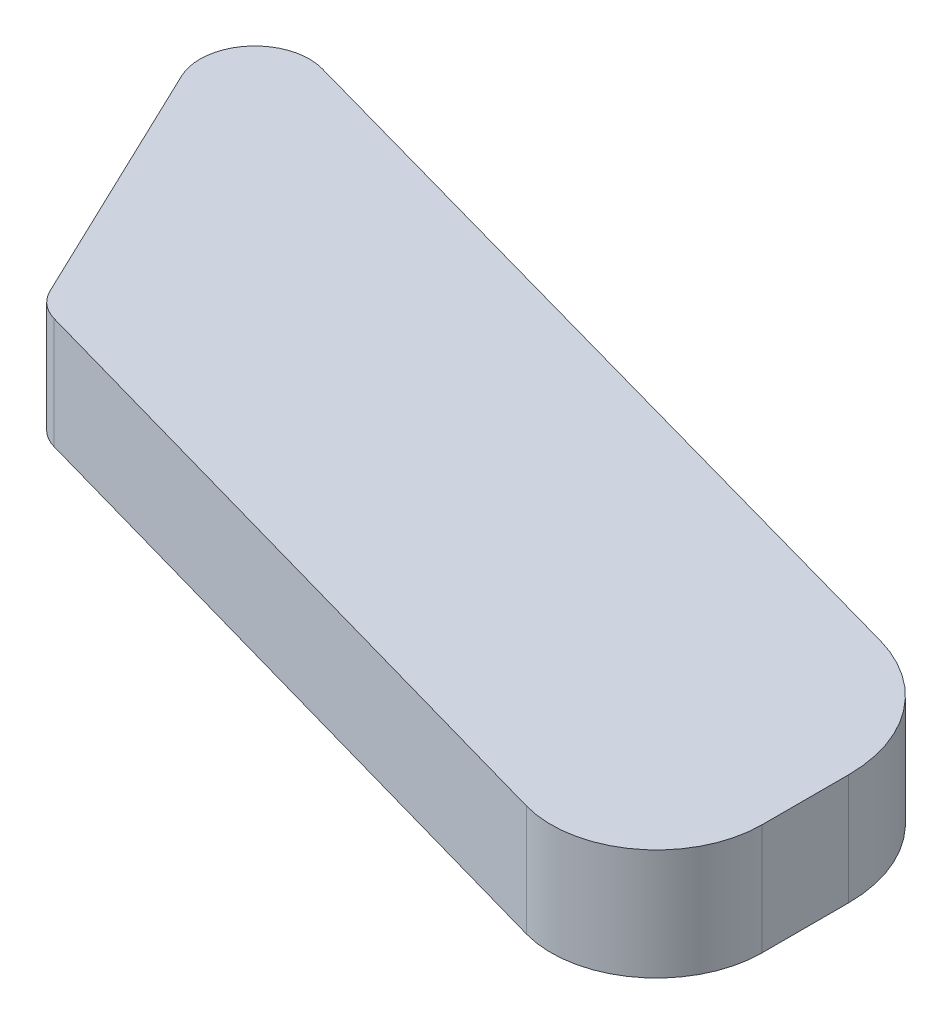
ISO-10303-21;
HEADER;
FILE_DESCRIPTION(('STEP AP214'),'2;1');
FILE_NAME('part.step','',(''),(''),'','','');
FILE_SCHEMA(('AUTOMOTIVE_DESIGN { 1 0 10303 214 1 1 1 1 }'));
ENDSEC;
DATA;
#1=APPLICATION_CONTEXT('core data for automotive mechanical design processes');
#2=APPLICATION_PROTOCOL_DEFINITION('international standard','automotive_design',2000,#1);
#3=PRODUCT_CONTEXT('',#1,'mechanical');
#4=PRODUCT('Part','Part','',(#3));
#5=PRODUCT_RELATED_PRODUCT_CATEGORY('part','',(#4));
#6=PRODUCT_DEFINITION_FORMATION('','',#4);
#7=PRODUCT_DEFINITION_CONTEXT('part definition',#1,'design');
#8=PRODUCT_DEFINITION('design','',#6,#7);
#9=PRODUCT_DEFINITION_SHAPE('','',#8);
#10=(LENGTH_UNIT() NAMED_UNIT(*) SI_UNIT(.MILLI.,.METRE.));
#11=(NAMED_UNIT(*) PLANE_ANGLE_UNIT() SI_UNIT($,.RADIAN.));
#12=(NAMED_UNIT(*) SI_UNIT($,.STERADIAN.) SOLID_ANGLE_UNIT());
#13=UNCERTAINTY_MEASURE_WITH_UNIT(LENGTH_MEASURE(1.E-05),#10,'distance_accuracy_value','');
#14=(GEOMETRIC_REPRESENTATION_CONTEXT(3) GLOBAL_UNCERTAINTY_ASSIGNED_CONTEXT((#13)) GLOBAL_UNIT_ASSIGNED_CONTEXT((#10,
#11,#12)) REPRESENTATION_CONTEXT('',''));
#15=CARTESIAN_POINT('',(0.,0.,0.));
#16=DIRECTION('',(0.,0.,1.));
#17=DIRECTION('',(1.,0.,0.));
#18=AXIS2_PLACEMENT_3D('',#15,#16,#17);
#19=CARTESIAN_POINT('',(-0.698314927087195,2.9906,4.1168302330735));
#20=DIRECTION('',(0.,-1.,0.));
#21=DIRECTION('',(-1.,0.,0.));
#22=AXIS2_PLACEMENT_3D('',#19,#20,#21);
#23=CYLINDRICAL_SURFACE('',#22,0.0296244305342817);
#24=CARTESIAN_POINT('',(-0.698314927087195,2.9906,4.1168302330735));
#25=DIRECTION('',(0.,1.,0.));
#26=DIRECTION('',(1.,0.,0.));
#27=AXIS2_PLACEMENT_3D('',#24,#25,#26);
#28=CIRCLE('',#27,0.0296244305342817);
#29=CARTESIAN_POINT('',(-0.727939357621477,2.9906,4.1168302330735));
#30=VERTEX_POINT('',#29);
#31=CARTESIAN_POINT('',(-0.725045279626244,2.9906,4.1296011037415));
#32=VERTEX_POINT('',#31);
#33=EDGE_CURVE('E11',#30,#32,#28,.T.);
#34=ORIENTED_EDGE('',*,*,#33,.F.);
#35=DIRECTION('',(0.,-1.,0.));
#36=VECTOR('',#35,1.);
#37=CARTESIAN_POINT('',(-0.727939357621477,2.9906,4.1168302330735));
#38=LINE('',#37,#36);
#39=CARTESIAN_POINT('',(-0.727939357621477,2.9306,4.1168302330735));
#40=VERTEX_POINT('',#39);
#41=EDGE_CURVE('E24',#30,#40,#38,.T.);
#42=ORIENTED_EDGE('',*,*,#41,.T.);
#43=CARTESIAN_POINT('',(-0.698314927087195,2.9306,4.1168302330735));
#44=DIRECTION('',(0.,1.,0.));
#45=DIRECTION('',(1.,0.,0.));
#46=AXIS2_PLACEMENT_3D('',#43,#44,#45);
#47=CIRCLE('',#46,0.0296244305342817);
#48=CARTESIAN_POINT('',(-0.725045279626244,2.9306,4.1296011037415));
#49=VERTEX_POINT('',#48);
#50=EDGE_CURVE('E157',#40,#49,#47,.T.);
#51=ORIENTED_EDGE('',*,*,#50,.T.);
#52=DIRECTION('',(0.,-1.,0.));
#53=VECTOR('',#52,1.);
#54=CARTESIAN_POINT('',(-0.725045279626244,2.9906,4.1296011037415));
#55=LINE('',#54,#53);
#56=EDGE_CURVE('E154',#32,#49,#55,.T.);
#57=ORIENTED_EDGE('',*,*,#56,.F.);
#58=EDGE_LOOP('',(#34,#42,#51,#57));
#59=FACE_BOUND('',#58,.T.);
#60=ADVANCED_FACE('F17',(#59),#23,.T.);
#61=CARTESIAN_POINT('',(-0.291431756941058,2.9906,4.27661368515));
#62=DIRECTION('',(0.,-1.,0.));
#63=DIRECTION('',(-1.,0.,0.));
#64=AXIS2_PLACEMENT_3D('',#61,#62,#63);
#65=CYLINDRICAL_SURFACE('',#64,0.0740610763358077);
#66=CARTESIAN_POINT('',(-0.291431756941058,2.9306,4.27661368515));
#67=DIRECTION('',(0.,1.,0.));
#68=DIRECTION('',(1.,0.,0.));
#69=AXIS2_PLACEMENT_3D('',#66,#67,#68);
#70=CIRCLE('',#69,0.0740610763358077);
#71=CARTESIAN_POINT('',(-0.21737068072653,2.9306,4.2766094467354));
#72=VERTEX_POINT('',#71);
#73=CARTESIAN_POINT('',(-0.271508401674307,2.9306,4.205282745559));
#74=VERTEX_POINT('',#73);
#75=EDGE_CURVE('E152',#72,#74,#70,.T.);
#76=ORIENTED_EDGE('',*,*,#75,.T.);
#77=DIRECTION('',(0.,-1.,0.));
#78=VECTOR('',#77,1.);
#79=CARTESIAN_POINT('',(-0.271508401674307,2.9906,4.205282745559));
#80=LINE('',#79,#78);
#81=CARTESIAN_POINT('',(-0.271508401674307,2.9906,4.205282745559));
#82=VERTEX_POINT('',#81);
#83=EDGE_CURVE('E149',#82,#74,#80,.T.);
#84=ORIENTED_EDGE('',*,*,#83,.F.);
#85=CARTESIAN_POINT('',(-0.291431756941058,2.9906,4.27661368515));
#86=DIRECTION('',(0.,1.,0.));
#87=DIRECTION('',(1.,0.,0.));
#88=AXIS2_PLACEMENT_3D('',#85,#86,#87);
#89=CIRCLE('',#88,0.0740610763358077);
#90=CARTESIAN_POINT('',(-0.21737068072653,2.9906,4.2766094467354));
#91=VERTEX_POINT('',#90);
#92=EDGE_CURVE('E147',#91,#82,#89,.T.);
#93=ORIENTED_EDGE('',*,*,#92,.F.);
#94=DIRECTION('',(0.,-1.,0.));
#95=VECTOR('',#94,1.);
#96=CARTESIAN_POINT('',(-0.21737068072653,2.9906,4.2766094467354));
#97=LINE('',#96,#95);
#98=EDGE_CURVE('E109',#91,#72,#97,.T.);
#99=ORIENTED_EDGE('',*,*,#98,.T.);
#100=EDGE_LOOP('',(#76,#84,#93,#99));
#101=FACE_BOUND('',#100,.T.);
#102=ADVANCED_FACE('F172',(#101),#65,.T.);
#103=CARTESIAN_POINT('',(-0.271508401674307,2.9906,4.205282745559));
#104=DIRECTION('',(-0.269012499581205,0.,0.963136685558738));
#105=DIRECTION('',(0.963136685558738,0.,0.269012499581205));
#106=AXIS2_PLACEMENT_3D('',#103,#104,#105);
#107=PLANE('',#106);
#108=DIRECTION('',(-0.963136685558738,0.,-0.269012499581205));
#109=VECTOR('',#108,1.);
#110=CARTESIAN_POINT('',(-0.271508401674307,2.9306,4.205282745559));
#111=LINE('',#110,#109);
#112=CARTESIAN_POINT('',(-0.690345584980515,2.9306,4.0882978572372));
#113=VERTEX_POINT('',#112);
#114=EDGE_CURVE('E144',#74,#113,#111,.T.);
#115=ORIENTED_EDGE('',*,*,#114,.T.);
#116=DIRECTION('',(0.,-1.,0.));
#117=VECTOR('',#116,1.);
#118=CARTESIAN_POINT('',(-0.690345584980515,2.9906,4.0882978572372));
#119=LINE('',#118,#117);
#120=CARTESIAN_POINT('',(-0.690345584980515,2.9906,4.0882978572372));
#121=VERTEX_POINT('',#120);
#122=EDGE_CURVE('E141',#121,#113,#119,.T.);
#123=ORIENTED_EDGE('',*,*,#122,.F.);
#124=DIRECTION('',(-0.963136685558738,0.,-0.269012499581205));
#125=VECTOR('',#124,1.);
#126=CARTESIAN_POINT('',(-0.271508401674307,2.9906,4.205282745559));
#127=LINE('',#126,#125);
#128=EDGE_CURVE('E138',#82,#121,#127,.T.);
#129=ORIENTED_EDGE('',*,*,#128,.F.);
#130=ORIENTED_EDGE('',*,*,#83,.T.);
#131=EDGE_LOOP('',(#115,#123,#129,#130));
#132=FACE_BOUND('',#131,.T.);
#133=ADVANCED_FACE('F170',(#132),#107,.F.);
#134=CARTESIAN_POINT('',(-0.698314927087195,2.9906,4.1168302330735));
#135=DIRECTION('',(0.,-1.,0.));
#136=DIRECTION('',(-1.,0.,0.));
#137=AXIS2_PLACEMENT_3D('',#134,#135,#136);
#138=CYLINDRICAL_SURFACE('',#137,0.0296244305342817);
#139=ORIENTED_EDGE('',*,*,#41,.F.);
#140=CARTESIAN_POINT('',(-0.698314927087195,2.9906,4.1168302330735));
#141=DIRECTION('',(0.,1.,0.));
#142=DIRECTION('',(1.,0.,0.));
#143=AXIS2_PLACEMENT_3D('',#140,#141,#142);
#144=CIRCLE('',#143,0.0296244305342817);
#145=EDGE_CURVE('E136',#121,#30,#144,.T.);
#146=ORIENTED_EDGE('',*,*,#145,.F.);
#147=ORIENTED_EDGE('',*,*,#122,.T.);
#148=CARTESIAN_POINT('',(-0.698314927087195,2.9306,4.1168302330735));
#149=DIRECTION('',(0.,1.,0.));
#150=DIRECTION('',(1.,0.,0.));
#151=AXIS2_PLACEMENT_3D('',#148,#149,#150);
#152=CIRCLE('',#151,0.0296244305342817);
#153=EDGE_CURVE('E133',#113,#40,#152,.T.);
#154=ORIENTED_EDGE('',*,*,#153,.T.);
#155=EDGE_LOOP('',(#139,#146,#147,#154));
#156=FACE_BOUND('',#155,.T.);
#157=ADVANCED_FACE('F167',(#156),#138,.T.);
#158=CARTESIAN_POINT('',(-0.725045279626244,2.9906,4.1296011037415));
#159=DIRECTION('',(0.902307725649932,0.,-0.431092528620535));
#160=DIRECTION('',(-0.431092528620535,0.,-0.902307725649932));
#161=AXIS2_PLACEMENT_3D('',#158,#159,#160);
#162=PLANE('',#161);
#163=DIRECTION('',(0.431092528620535,0.,0.902307725649932));
#164=VECTOR('',#163,1.);
#165=CARTESIAN_POINT('',(-0.725045279626244,2.9306,4.1296011037415));
#166=LINE('',#165,#164);
#167=CARTESIAN_POINT('',(-0.659881299097407,2.9306,4.2659940105113));
#168=VERTEX_POINT('',#167);
#169=EDGE_CURVE('E131',#49,#168,#166,.T.);
#170=ORIENTED_EDGE('',*,*,#169,.T.);
#171=DIRECTION('',(0.,-1.,0.));
#172=VECTOR('',#171,1.);
#173=CARTESIAN_POINT('',(-0.659881299097407,2.9906,4.2659940105113));
#174=LINE('',#173,#172);
#175=CARTESIAN_POINT('',(-0.659881299097407,2.9906,4.2659940105113));
#176=VERTEX_POINT('',#175);
#177=EDGE_CURVE('E128',#176,#168,#174,.T.);
#178=ORIENTED_EDGE('',*,*,#177,.F.);
#179=DIRECTION('',(0.431092528620535,0.,0.902307725649932));
#180=VECTOR('',#179,1.);
#181=CARTESIAN_POINT('',(-0.725045279626244,2.9906,4.1296011037415));
#182=LINE('',#181,#180);
#183=EDGE_CURVE('E126',#32,#176,#182,.T.);
#184=ORIENTED_EDGE('',*,*,#183,.F.);
#185=ORIENTED_EDGE('',*,*,#56,.T.);
#186=EDGE_LOOP('',(#170,#178,#184,#185));
#187=FACE_BOUND('',#186,.T.);
#188=ADVANCED_FACE('F181',(#187),#162,.F.);
#189=CARTESIAN_POINT('',(-0.639833534693121,2.9906,4.2564158575103));
#190=DIRECTION('',(0.,-1.,0.));
#191=DIRECTION('',(-1.,0.,0.));
#192=AXIS2_PLACEMENT_3D('',#189,#190,#191);
#193=CYLINDRICAL_SURFACE('',#192,0.0222183229006932);
#194=CARTESIAN_POINT('',(-0.639833534693121,2.9306,4.2564158575103));
#195=DIRECTION('',(0.,1.,0.));
#196=DIRECTION('',(1.,0.,0.));
#197=AXIS2_PLACEMENT_3D('',#194,#195,#196);
#198=CIRCLE('',#197,0.0222183229006932);
#199=CARTESIAN_POINT('',(-0.645872484521788,2.9306,4.2777977413723));
#200=VERTEX_POINT('',#199);
#201=EDGE_CURVE('E124',#168,#200,#198,.T.);
#202=ORIENTED_EDGE('',*,*,#201,.T.);
#203=DIRECTION('',(0.,-1.,0.));
#204=VECTOR('',#203,1.);
#205=CARTESIAN_POINT('',(-0.645872484521788,2.9906,4.2777977413723));
#206=LINE('',#205,#204);
#207=CARTESIAN_POINT('',(-0.645872484521788,2.9906,4.2777977413723));
#208=VERTEX_POINT('',#207);
#209=EDGE_CURVE('E121',#208,#200,#206,.T.);
#210=ORIENTED_EDGE('',*,*,#209,.F.);
#211=CARTESIAN_POINT('',(-0.639833534693121,2.9906,4.2564158575103));
#212=DIRECTION('',(0.,1.,0.));
#213=DIRECTION('',(1.,0.,0.));
#214=AXIS2_PLACEMENT_3D('',#211,#212,#213);
#215=CIRCLE('',#214,0.0222183229006932);
#216=EDGE_CURVE('E119',#176,#208,#215,.T.);
#217=ORIENTED_EDGE('',*,*,#216,.F.);
#218=ORIENTED_EDGE('',*,*,#177,.T.);
#219=EDGE_LOOP('',(#202,#210,#217,#218));
#220=FACE_BOUND('',#219,.T.);
#221=ADVANCED_FACE('F178',(#220),#193,.T.);
#222=CARTESIAN_POINT('',(-0.645872484521788,2.9906,4.2777977413723));
#223=DIRECTION('',(0.271800434966713,0.,-0.962353637470086));
#224=DIRECTION('',(-0.962353637470086,0.,-0.271800434966713));
#225=AXIS2_PLACEMENT_3D('',#222,#223,#224);
#226=PLANE('',#225);
#227=DIRECTION('',(0.962353637470086,0.,0.271800434966713));
#228=VECTOR('',#227,1.);
#229=CARTESIAN_POINT('',(-0.645872484521788,2.9306,4.2777977413723));
#230=LINE('',#229,#228);
#231=CARTESIAN_POINT('',(-0.289894999782774,2.9306,4.3783375340464));
#232=VERTEX_POINT('',#231);
#233=EDGE_CURVE('E117',#200,#232,#230,.T.);
#234=ORIENTED_EDGE('',*,*,#233,.T.);
#235=DIRECTION('',(0.,-1.,0.));
#236=VECTOR('',#235,1.);
#237=CARTESIAN_POINT('',(-0.289894999782774,2.9906,4.3783375340464));
#238=LINE('',#237,#236);
#239=CARTESIAN_POINT('',(-0.289894999782774,2.9906,4.3783375340464));
#240=VERTEX_POINT('',#239);
#241=EDGE_CURVE('E115',#240,#232,#238,.T.);
#242=ORIENTED_EDGE('',*,*,#241,.F.);
#243=DIRECTION('',(0.962353637470086,0.,0.271800434966713));
#244=VECTOR('',#243,1.);
#245=CARTESIAN_POINT('',(-0.645872484521788,2.9906,4.2777977413723));
#246=LINE('',#245,#244);
#247=EDGE_CURVE('E103',#208,#240,#246,.T.);
#248=ORIENTED_EDGE('',*,*,#247,.F.);
#249=ORIENTED_EDGE('',*,*,#209,.T.);
#250=EDGE_LOOP('',(#234,#242,#248,#249));
#251=FACE_BOUND('',#250,.T.);
#252=ADVANCED_FACE('F175',(#251),#226,.F.);
#253=CARTESIAN_POINT('',(-0.274395028555896,2.9906,4.3234573654673));
#254=DIRECTION('',(0.,-1.,0.));
#255=DIRECTION('',(-1.,0.,0.));
#256=AXIS2_PLACEMENT_3D('',#253,#254,#255);
#257=CYLINDRICAL_SURFACE('',#256,0.0570270287785539);
#258=CARTESIAN_POINT('',(-0.274395028555896,2.9306,4.3234573654673));
#259=DIRECTION('',(0.,1.,0.));
#260=DIRECTION('',(1.,0.,0.));
#261=AXIS2_PLACEMENT_3D('',#258,#259,#260);
#262=CIRCLE('',#261,0.0570270287785539);
#263=CARTESIAN_POINT('',(-0.217367999870729,2.9306,4.323454101888));
#264=VERTEX_POINT('',#263);
#265=EDGE_CURVE('E90',#232,#264,#262,.T.);
#266=ORIENTED_EDGE('',*,*,#265,.T.);
#267=DIRECTION('',(0.,-1.,0.));
#268=VECTOR('',#267,1.);
#269=CARTESIAN_POINT('',(-0.217367999870729,2.9906,4.323454101888));
#270=LINE('',#269,#268);
#271=CARTESIAN_POINT('',(-0.217367999870729,2.9906,4.323454101888));
#272=VERTEX_POINT('',#271);
#273=EDGE_CURVE('E84',#272,#264,#270,.T.);
#274=ORIENTED_EDGE('',*,*,#273,.F.);
#275=CARTESIAN_POINT('',(-0.274395028555896,2.9906,4.3234573654673));
#276=DIRECTION('',(0.,1.,0.));
#277=DIRECTION('',(1.,0.,0.));
#278=AXIS2_PLACEMENT_3D('',#275,#276,#277);
#279=CIRCLE('',#278,0.0570270287785539);
#280=EDGE_CURVE('E88',#240,#272,#279,.T.);
#281=ORIENTED_EDGE('',*,*,#280,.F.);
#282=ORIENTED_EDGE('',*,*,#241,.T.);
#283=EDGE_LOOP('',(#266,#274,#281,#282));
#284=FACE_BOUND('',#283,.T.);
#285=ADVANCED_FACE('F86',(#284),#257,.T.);
#286=CARTESIAN_POINT('',(-0.217367999870729,2.9906,4.323454101888));
#287=DIRECTION('',(-0.999999998362442,0.,5.72286376773894E-05));
#288=DIRECTION('',(5.72286376773894E-05,0.,0.999999998362442));
#289=AXIS2_PLACEMENT_3D('',#286,#287,#288);
#290=PLANE('',#289);
#291=DIRECTION('',(-5.72286376773894E-05,0.,-0.999999998362441));
#292=VECTOR('',#291,1.);
#293=CARTESIAN_POINT('',(-0.217367999870729,2.9306,4.323454101888));
#294=LINE('',#293,#292);
#295=EDGE_CURVE('E104',#264,#72,#294,.T.);
#296=ORIENTED_EDGE('',*,*,#295,.T.);
#297=ORIENTED_EDGE('',*,*,#98,.F.);
#298=DIRECTION('',(-5.72286376773894E-05,0.,-0.999999998362441));
#299=VECTOR('',#298,1.);
#300=CARTESIAN_POINT('',(-0.217367999870729,2.9906,4.323454101888));
#301=LINE('',#300,#299);
#302=EDGE_CURVE('E100',#272,#91,#301,.T.);
#303=ORIENTED_EDGE('',*,*,#302,.F.);
#304=ORIENTED_EDGE('',*,*,#273,.T.);
#305=EDGE_LOOP('',(#296,#297,#303,#304));
#306=FACE_BOUND('',#305,.T.);
#307=ADVANCED_FACE('F107',(#306),#290,.F.);
#308=CARTESIAN_POINT('',(-0.291431756941058,2.9906,4.27661368515));
#309=DIRECTION('',(0.,1.,0.));
#310=DIRECTION('',(1.,0.,0.));
#311=AXIS2_PLACEMENT_3D('',#308,#309,#310);
#312=PLANE('',#311);
#313=ORIENTED_EDGE('',*,*,#92,.T.);
#314=ORIENTED_EDGE('',*,*,#128,.T.);
#315=ORIENTED_EDGE('',*,*,#145,.T.);
#316=ORIENTED_EDGE('',*,*,#33,.T.);
#317=ORIENTED_EDGE('',*,*,#183,.T.);
#318=ORIENTED_EDGE('',*,*,#216,.T.);
#319=ORIENTED_EDGE('',*,*,#247,.T.);
#320=ORIENTED_EDGE('',*,*,#280,.T.);
#321=ORIENTED_EDGE('',*,*,#302,.T.);
#322=EDGE_LOOP('',(#313,#314,#315,#316,#317,#318,#319,#320,#321));
#323=FACE_BOUND('',#322,.T.);
#324=ADVANCED_FACE('F99',(#323),#312,.T.);
#325=CARTESIAN_POINT('',(-0.291431756941058,2.9306,4.27661368515));
#326=DIRECTION('',(0.,1.,0.));
#327=DIRECTION('',(1.,0.,0.));
#328=AXIS2_PLACEMENT_3D('',#325,#326,#327);
#329=PLANE('',#328);
#330=ORIENTED_EDGE('',*,*,#75,.F.);
#331=ORIENTED_EDGE('',*,*,#295,.F.);
#332=ORIENTED_EDGE('',*,*,#265,.F.);
#333=ORIENTED_EDGE('',*,*,#233,.F.);
#334=ORIENTED_EDGE('',*,*,#201,.F.);
#335=ORIENTED_EDGE('',*,*,#169,.F.);
#336=ORIENTED_EDGE('',*,*,#50,.F.);
#337=ORIENTED_EDGE('',*,*,#153,.F.);
#338=ORIENTED_EDGE('',*,*,#114,.F.);
#339=EDGE_LOOP('',(#330,#331,#332,#333,#334,#335,#336,#337,#338));
#340=FACE_BOUND('',#339,.T.);
#341=ADVANCED_FACE('F164',(#340),#329,.F.);
#342=CLOSED_SHELL('',(#60,#102,#133,#157,#188,#221,#252,#285,#307,#324,#341));
#343=MANIFOLD_SOLID_BREP('B1',#342);
#344=ADVANCED_BREP_SHAPE_REPRESENTATION('',(#18,#343),#14);
#345=SHAPE_DEFINITION_REPRESENTATION(#9,#344);
ENDSEC;
END-ISO-10303-21;
